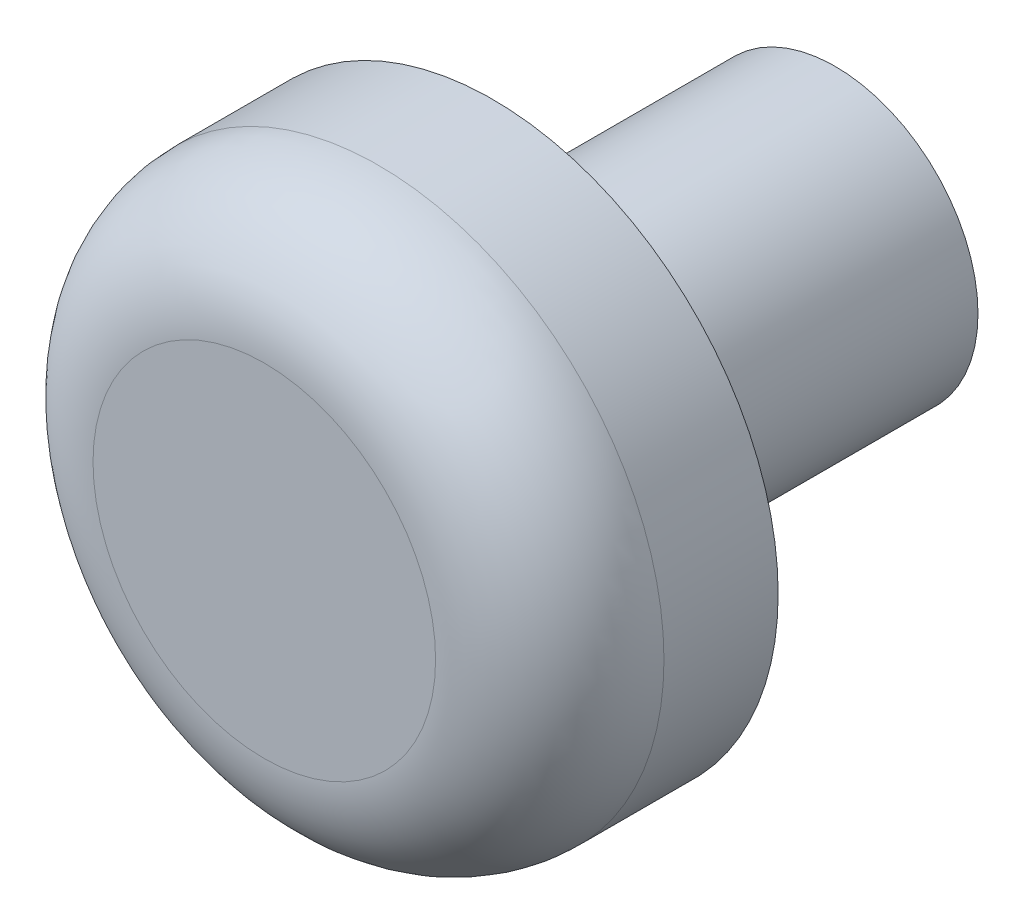
ISO-10303-21;
HEADER;
FILE_DESCRIPTION(('STEP AP214'),'2;1');
FILE_NAME('part.step','',(''),(''),'','','');
FILE_SCHEMA(('AUTOMOTIVE_DESIGN { 1 0 10303 214 1 1 1 1 }'));
ENDSEC;
DATA;
#1=APPLICATION_CONTEXT('core data for automotive mechanical design processes');
#2=APPLICATION_PROTOCOL_DEFINITION('international standard','automotive_design',2000,#1);
#3=PRODUCT_CONTEXT('',#1,'mechanical');
#4=PRODUCT('Part','Part','',(#3));
#5=PRODUCT_RELATED_PRODUCT_CATEGORY('part','',(#4));
#6=PRODUCT_DEFINITION_FORMATION('','',#4);
#7=PRODUCT_DEFINITION_CONTEXT('part definition',#1,'design');
#8=PRODUCT_DEFINITION('design','',#6,#7);
#9=PRODUCT_DEFINITION_SHAPE('','',#8);
#10=(LENGTH_UNIT() NAMED_UNIT(*) SI_UNIT(.MILLI.,.METRE.));
#11=(NAMED_UNIT(*) PLANE_ANGLE_UNIT() SI_UNIT($,.RADIAN.));
#12=(NAMED_UNIT(*) SI_UNIT($,.STERADIAN.) SOLID_ANGLE_UNIT());
#13=UNCERTAINTY_MEASURE_WITH_UNIT(LENGTH_MEASURE(1.E-05),#10,'distance_accuracy_value','');
#14=(GEOMETRIC_REPRESENTATION_CONTEXT(3) GLOBAL_UNCERTAINTY_ASSIGNED_CONTEXT((#13)) GLOBAL_UNIT_ASSIGNED_CONTEXT((#10,
#11,#12)) REPRESENTATION_CONTEXT('',''));
#15=CARTESIAN_POINT('',(0.,0.,0.));
#16=DIRECTION('',(0.,0.,1.));
#17=DIRECTION('',(1.,0.,0.));
#18=AXIS2_PLACEMENT_3D('',#15,#16,#17);
#19=CARTESIAN_POINT('',(0.,0.,3.));
#20=DIRECTION('',(0.,0.,-1.));
#21=DIRECTION('',(-1.,0.,0.));
#22=AXIS2_PLACEMENT_3D('',#19,#20,#21);
#23=CYLINDRICAL_SURFACE('',#22,1.25);
#24=CARTESIAN_POINT('',(0.,0.,3.));
#25=DIRECTION('',(0.,0.,1.));
#26=DIRECTION('',(1.,0.,0.));
#27=AXIS2_PLACEMENT_3D('',#24,#25,#26);
#28=CIRCLE('',#27,1.25);
#29=CARTESIAN_POINT('',(1.25,0.,3.));
#30=VERTEX_POINT('',#29);
#31=EDGE_CURVE('E42',#30,#30,#28,.T.);
#32=ORIENTED_EDGE('',*,*,#31,.F.);
#33=EDGE_LOOP('',(#32));
#34=FACE_BOUND('',#33,.T.);
#35=CARTESIAN_POINT('',(0.,0.,0.));
#36=DIRECTION('',(0.,0.,1.));
#37=DIRECTION('',(1.,0.,0.));
#38=AXIS2_PLACEMENT_3D('',#35,#36,#37);
#39=CIRCLE('',#38,1.25);
#40=CARTESIAN_POINT('',(1.25,0.,0.));
#41=VERTEX_POINT('',#40);
#42=EDGE_CURVE('E46',#41,#41,#39,.T.);
#43=ORIENTED_EDGE('',*,*,#42,.T.);
#44=EDGE_LOOP('',(#43));
#45=FACE_BOUND('',#44,.T.);
#46=ADVANCED_FACE('F31',(#34,#45),#23,.T.);
#47=CARTESIAN_POINT('',(0.,0.,0.));
#48=DIRECTION('',(0.,0.,1.));
#49=DIRECTION('',(1.,0.,0.));
#50=AXIS2_PLACEMENT_3D('',#47,#48,#49);
#51=PLANE('',#50);
#52=ORIENTED_EDGE('',*,*,#42,.F.);
#53=EDGE_LOOP('',(#52));
#54=FACE_BOUND('',#53,.T.);
#55=ADVANCED_FACE('F70',(#54),#51,.F.);
#56=CARTESIAN_POINT('',(0.,0.,5.));
#57=DIRECTION('',(0.,0.,-1.));
#58=DIRECTION('',(-1.,0.,0.));
#59=AXIS2_PLACEMENT_3D('',#56,#57,#58);
#60=CYLINDRICAL_SURFACE('',#59,2.5);
#61=CARTESIAN_POINT('',(0.,0.,4.));
#62=DIRECTION('',(0.,0.,1.));
#63=DIRECTION('',(1.,0.,0.));
#64=AXIS2_PLACEMENT_3D('',#61,#62,#63);
#65=CIRCLE('',#64,2.5);
#66=CARTESIAN_POINT('',(2.5,0.,4.));
#67=VERTEX_POINT('',#66);
#68=EDGE_CURVE('E10',#67,#67,#65,.F.);
#69=ORIENTED_EDGE('',*,*,#68,.T.);
#70=EDGE_LOOP('',(#69));
#71=FACE_BOUND('',#70,.T.);
#72=CARTESIAN_POINT('',(0.,0.,3.));
#73=DIRECTION('',(0.,0.,1.));
#74=DIRECTION('',(1.,0.,0.));
#75=AXIS2_PLACEMENT_3D('',#72,#73,#74);
#76=CIRCLE('',#75,2.5);
#77=CARTESIAN_POINT('',(2.5,0.,3.));
#78=VERTEX_POINT('',#77);
#79=EDGE_CURVE('E50',#78,#78,#76,.T.);
#80=ORIENTED_EDGE('',*,*,#79,.T.);
#81=EDGE_LOOP('',(#80));
#82=FACE_BOUND('',#81,.T.);
#83=ADVANCED_FACE('F55',(#71,#82),#60,.T.);
#84=CARTESIAN_POINT('',(0.,0.,5.));
#85=DIRECTION('',(0.,0.,1.));
#86=DIRECTION('',(1.,0.,0.));
#87=AXIS2_PLACEMENT_3D('',#84,#85,#86);
#88=PLANE('',#87);
#89=CARTESIAN_POINT('',(0.,0.,5.));
#90=DIRECTION('',(0.,0.,1.));
#91=DIRECTION('',(1.,0.,0.));
#92=AXIS2_PLACEMENT_3D('',#89,#90,#91);
#93=CIRCLE('',#92,1.5);
#94=CARTESIAN_POINT('',(1.5,0.,5.));
#95=VERTEX_POINT('',#94);
#96=EDGE_CURVE('E38',#95,#95,#93,.T.);
#97=ORIENTED_EDGE('',*,*,#96,.T.);
#98=EDGE_LOOP('',(#97));
#99=FACE_BOUND('',#98,.T.);
#100=ADVANCED_FACE('F59',(#99),#88,.T.);
#101=CARTESIAN_POINT('',(0.,0.,3.));
#102=DIRECTION('',(0.,0.,1.));
#103=DIRECTION('',(1.,0.,0.));
#104=AXIS2_PLACEMENT_3D('',#101,#102,#103);
#105=PLANE('',#104);
#106=ORIENTED_EDGE('',*,*,#31,.T.);
#107=EDGE_LOOP('',(#106));
#108=FACE_BOUND('',#107,.T.);
#109=ORIENTED_EDGE('',*,*,#79,.F.);
#110=EDGE_LOOP('',(#109));
#111=FACE_BOUND('',#110,.T.);
#112=ADVANCED_FACE('F57',(#108,#111),#105,.F.);
#113=CARTESIAN_POINT('',(0.,0.,4.));
#114=DIRECTION('',(0.,0.,1.));
#115=DIRECTION('',(1.,0.,0.));
#116=AXIS2_PLACEMENT_3D('',#113,#114,#115);
#117=TOROIDAL_SURFACE('',#116,1.5,1.);
#118=ORIENTED_EDGE('',*,*,#68,.F.);
#119=EDGE_LOOP('',(#118));
#120=FACE_BOUND('',#119,.T.);
#121=ORIENTED_EDGE('',*,*,#96,.F.);
#122=EDGE_LOOP('',(#121));
#123=FACE_BOUND('',#122,.T.);
#124=ADVANCED_FACE('F33',(#120,#123),#117,.T.);
#125=CLOSED_SHELL('',(#46,#55,#83,#100,#112,#124));
#126=MANIFOLD_SOLID_BREP('B2',#125);
#127=ADVANCED_BREP_SHAPE_REPRESENTATION('',(#18,#126),#14);
#128=SHAPE_DEFINITION_REPRESENTATION(#9,#127);
ENDSEC;
END-ISO-10303-21;
